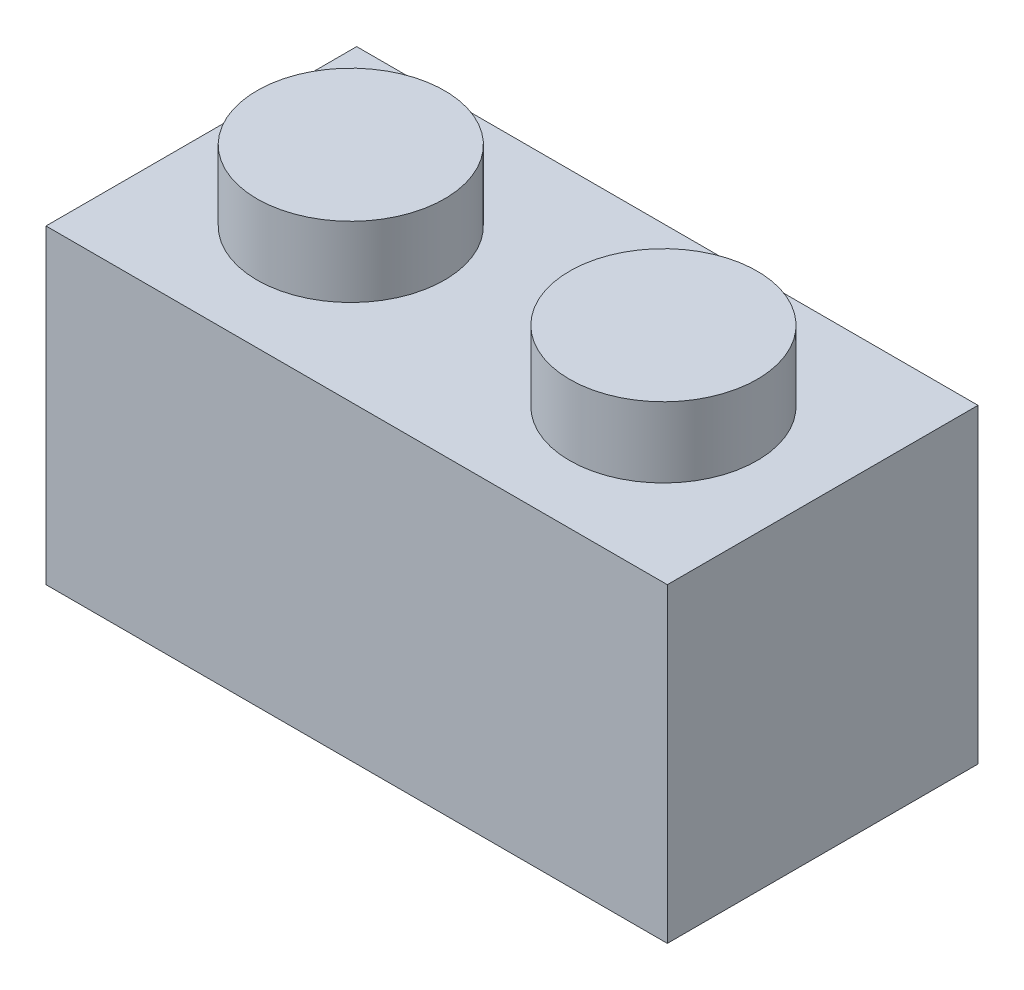
ISO-10303-21;
HEADER;
FILE_DESCRIPTION(('STEP AP214'),'2;1');
FILE_NAME('part.step','',(''),(''),'','','');
FILE_SCHEMA(('AUTOMOTIVE_DESIGN { 1 0 10303 214 1 1 1 1 }'));
ENDSEC;
DATA;
#1=APPLICATION_CONTEXT('core data for automotive mechanical design processes');
#2=APPLICATION_PROTOCOL_DEFINITION('international standard','automotive_design',2000,#1);
#3=PRODUCT_CONTEXT('',#1,'mechanical');
#4=PRODUCT('Part','Part','',(#3));
#5=PRODUCT_RELATED_PRODUCT_CATEGORY('part','',(#4));
#6=PRODUCT_DEFINITION_FORMATION('','',#4);
#7=PRODUCT_DEFINITION_CONTEXT('part definition',#1,'design');
#8=PRODUCT_DEFINITION('design','',#6,#7);
#9=PRODUCT_DEFINITION_SHAPE('','',#8);
#10=(LENGTH_UNIT() NAMED_UNIT(*) SI_UNIT(.MILLI.,.METRE.));
#11=(NAMED_UNIT(*) PLANE_ANGLE_UNIT() SI_UNIT($,.RADIAN.));
#12=(NAMED_UNIT(*) SI_UNIT($,.STERADIAN.) SOLID_ANGLE_UNIT());
#13=UNCERTAINTY_MEASURE_WITH_UNIT(LENGTH_MEASURE(1.E-05),#10,'distance_accuracy_value','');
#14=(GEOMETRIC_REPRESENTATION_CONTEXT(3) GLOBAL_UNCERTAINTY_ASSIGNED_CONTEXT((#13)) GLOBAL_UNIT_ASSIGNED_CONTEXT((#10,
#11,#12)) REPRESENTATION_CONTEXT('',''));
#15=CARTESIAN_POINT('',(0.,0.,0.));
#16=DIRECTION('',(0.,0.,1.));
#17=DIRECTION('',(1.,0.,0.));
#18=AXIS2_PLACEMENT_3D('',#15,#16,#17);
#19=CARTESIAN_POINT('',(-7.95000000000001,-3.975,-7.95));
#20=DIRECTION('',(0.,-1.,0.));
#21=DIRECTION('',(0.,0.,-1.));
#22=AXIS2_PLACEMENT_3D('',#19,#20,#21);
#23=PLANE('',#22);
#24=DIRECTION('',(1.,0.,0.));
#25=VECTOR('',#24,1.);
#26=CARTESIAN_POINT('',(-7.95000000000001,-3.975,0.));
#27=LINE('',#26,#25);
#28=CARTESIAN_POINT('',(-7.95000000000001,-3.975,0.));
#29=VERTEX_POINT('',#28);
#30=CARTESIAN_POINT('',(7.94999999999999,-3.975,0.));
#31=VERTEX_POINT('',#30);
#32=EDGE_CURVE('E175',#29,#31,#27,.T.);
#33=ORIENTED_EDGE('',*,*,#32,.F.);
#34=DIRECTION('',(0.,0.,1.));
#35=VECTOR('',#34,1.);
#36=CARTESIAN_POINT('',(-7.95000000000001,-3.975,-7.95));
#37=LINE('',#36,#35);
#38=CARTESIAN_POINT('',(-7.95000000000001,-3.975,-7.95));
#39=VERTEX_POINT('',#38);
#40=EDGE_CURVE('E43',#39,#29,#37,.T.);
#41=ORIENTED_EDGE('',*,*,#40,.F.);
#42=DIRECTION('',(1.,0.,0.));
#43=VECTOR('',#42,1.);
#44=CARTESIAN_POINT('',(-7.95000000000001,-3.975,-7.95));
#45=LINE('',#44,#43);
#46=CARTESIAN_POINT('',(7.94999999999999,-3.975,-7.95));
#47=VERTEX_POINT('',#46);
#48=EDGE_CURVE('E180',#39,#47,#45,.T.);
#49=ORIENTED_EDGE('',*,*,#48,.T.);
#50=DIRECTION('',(0.,0.,1.));
#51=VECTOR('',#50,1.);
#52=CARTESIAN_POINT('',(7.94999999999999,-3.975,-7.95));
#53=LINE('',#52,#51);
#54=EDGE_CURVE('E11',#47,#31,#53,.T.);
#55=ORIENTED_EDGE('',*,*,#54,.T.);
#56=EDGE_LOOP('',(#33,#41,#49,#55));
#57=FACE_BOUND('',#56,.T.);
#58=DIRECTION('',(0.,0.,1.));
#59=VECTOR('',#58,1.);
#60=CARTESIAN_POINT('',(-6.75000000000001,-3.975,-7.95));
#61=LINE('',#60,#59);
#62=CARTESIAN_POINT('',(-6.75000000000001,-3.975,-6.75));
#63=VERTEX_POINT('',#62);
#64=CARTESIAN_POINT('',(-6.75000000000001,-3.975,-1.2));
#65=VERTEX_POINT('',#64);
#66=EDGE_CURVE('E149',#63,#65,#61,.T.);
#67=ORIENTED_EDGE('',*,*,#66,.T.);
#68=DIRECTION('',(1.,0.,0.));
#69=VECTOR('',#68,1.);
#70=CARTESIAN_POINT('',(-7.95000000000001,-3.975,-1.2));
#71=LINE('',#70,#69);
#72=CARTESIAN_POINT('',(6.75,-3.975,-1.2));
#73=VERTEX_POINT('',#72);
#74=EDGE_CURVE('E138',#65,#73,#71,.T.);
#75=ORIENTED_EDGE('',*,*,#74,.T.);
#76=DIRECTION('',(0.,0.,1.));
#77=VECTOR('',#76,1.);
#78=CARTESIAN_POINT('',(6.75,-3.975,-7.95));
#79=LINE('',#78,#77);
#80=CARTESIAN_POINT('',(6.75,-3.975,-6.75));
#81=VERTEX_POINT('',#80);
#82=EDGE_CURVE('E130',#81,#73,#79,.T.);
#83=ORIENTED_EDGE('',*,*,#82,.F.);
#84=DIRECTION('',(1.,0.,0.));
#85=VECTOR('',#84,1.);
#86=CARTESIAN_POINT('',(-7.95000000000001,-3.975,-6.75));
#87=LINE('',#86,#85);
#88=EDGE_CURVE('E51',#63,#81,#87,.T.);
#89=ORIENTED_EDGE('',*,*,#88,.F.);
#90=EDGE_LOOP('',(#67,#75,#83,#89));
#91=FACE_BOUND('',#90,.T.);
#92=ADVANCED_FACE('F34',(#57,#91),#23,.T.);
#93=CARTESIAN_POINT('',(7.94999999999999,-3.975,-7.95));
#94=DIRECTION('',(1.,0.,0.));
#95=DIRECTION('',(0.,0.,-1.));
#96=AXIS2_PLACEMENT_3D('',#93,#94,#95);
#97=PLANE('',#96);
#98=DIRECTION('',(0.,1.,0.));
#99=VECTOR('',#98,1.);
#100=CARTESIAN_POINT('',(7.94999999999999,-3.975,0.));
#101=LINE('',#100,#99);
#102=CARTESIAN_POINT('',(7.94999999999999,3.975,0.));
#103=VERTEX_POINT('',#102);
#104=EDGE_CURVE('E169',#31,#103,#101,.T.);
#105=ORIENTED_EDGE('',*,*,#104,.F.);
#106=ORIENTED_EDGE('',*,*,#54,.F.);
#107=DIRECTION('',(0.,1.,0.));
#108=VECTOR('',#107,1.);
#109=CARTESIAN_POINT('',(7.94999999999999,-3.975,-7.95));
#110=LINE('',#109,#108);
#111=CARTESIAN_POINT('',(7.94999999999999,3.975,-7.95));
#112=VERTEX_POINT('',#111);
#113=EDGE_CURVE('E172',#47,#112,#110,.T.);
#114=ORIENTED_EDGE('',*,*,#113,.T.);
#115=DIRECTION('',(0.,0.,1.));
#116=VECTOR('',#115,1.);
#117=CARTESIAN_POINT('',(7.94999999999999,3.975,-7.95));
#118=LINE('',#117,#116);
#119=EDGE_CURVE('E38',#112,#103,#118,.T.);
#120=ORIENTED_EDGE('',*,*,#119,.T.);
#121=EDGE_LOOP('',(#105,#106,#114,#120));
#122=FACE_BOUND('',#121,.T.);
#123=ADVANCED_FACE('F36',(#122),#97,.T.);
#124=CARTESIAN_POINT('',(-7.95000000000001,-3.975,-7.95));
#125=DIRECTION('',(-1.,0.,0.));
#126=DIRECTION('',(0.,0.,1.));
#127=AXIS2_PLACEMENT_3D('',#124,#125,#126);
#128=PLANE('',#127);
#129=DIRECTION('',(0.,-1.,0.));
#130=VECTOR('',#129,1.);
#131=CARTESIAN_POINT('',(-7.95000000000001,-3.975,0.));
#132=LINE('',#131,#130);
#133=CARTESIAN_POINT('',(-7.95000000000001,3.975,0.));
#134=VERTEX_POINT('',#133);
#135=EDGE_CURVE('E187',#134,#29,#132,.T.);
#136=ORIENTED_EDGE('',*,*,#135,.F.);
#137=DIRECTION('',(0.,0.,1.));
#138=VECTOR('',#137,1.);
#139=CARTESIAN_POINT('',(-7.95000000000001,3.975,-7.95));
#140=LINE('',#139,#138);
#141=CARTESIAN_POINT('',(-7.95000000000001,3.975,-7.95));
#142=VERTEX_POINT('',#141);
#143=EDGE_CURVE('E192',#142,#134,#140,.T.);
#144=ORIENTED_EDGE('',*,*,#143,.F.);
#145=DIRECTION('',(0.,-1.,0.));
#146=VECTOR('',#145,1.);
#147=CARTESIAN_POINT('',(-7.95000000000001,-3.975,-7.95));
#148=LINE('',#147,#146);
#149=EDGE_CURVE('E177',#142,#39,#148,.T.);
#150=ORIENTED_EDGE('',*,*,#149,.T.);
#151=ORIENTED_EDGE('',*,*,#40,.T.);
#152=EDGE_LOOP('',(#136,#144,#150,#151));
#153=FACE_BOUND('',#152,.T.);
#154=ADVANCED_FACE('F201',(#153),#128,.T.);
#155=CARTESIAN_POINT('',(-7.95000000000001,3.975,-7.95));
#156=DIRECTION('',(0.,1.,0.));
#157=DIRECTION('',(0.,0.,1.));
#158=AXIS2_PLACEMENT_3D('',#155,#156,#157);
#159=PLANE('',#158);
#160=CARTESIAN_POINT('',(3.95,3.975,-3.9));
#161=DIRECTION('',(0.,1.,0.));
#162=DIRECTION('',(0.,0.,1.));
#163=AXIS2_PLACEMENT_3D('',#160,#161,#162);
#164=CIRCLE('',#163,2.4);
#165=CARTESIAN_POINT('',(3.95,3.975,-1.5));
#166=VERTEX_POINT('',#165);
#167=EDGE_CURVE('E155',#166,#166,#164,.T.);
#168=ORIENTED_EDGE('',*,*,#167,.F.);
#169=EDGE_LOOP('',(#168));
#170=FACE_BOUND('',#169,.T.);
#171=CARTESIAN_POINT('',(-4.05,3.975,-3.9));
#172=DIRECTION('',(0.,1.,0.));
#173=DIRECTION('',(0.,0.,1.));
#174=AXIS2_PLACEMENT_3D('',#171,#172,#173);
#175=CIRCLE('',#174,2.4);
#176=CARTESIAN_POINT('',(-4.05,3.975,-1.5));
#177=VERTEX_POINT('',#176);
#178=EDGE_CURVE('E165',#177,#177,#175,.T.);
#179=ORIENTED_EDGE('',*,*,#178,.F.);
#180=EDGE_LOOP('',(#179));
#181=FACE_BOUND('',#180,.T.);
#182=DIRECTION('',(-1.,0.,0.));
#183=VECTOR('',#182,1.);
#184=CARTESIAN_POINT('',(-7.95000000000001,3.975,0.));
#185=LINE('',#184,#183);
#186=EDGE_CURVE('E184',#103,#134,#185,.T.);
#187=ORIENTED_EDGE('',*,*,#186,.F.);
#188=ORIENTED_EDGE('',*,*,#119,.F.);
#189=DIRECTION('',(-1.,0.,0.));
#190=VECTOR('',#189,1.);
#191=CARTESIAN_POINT('',(-7.95000000000001,3.975,-7.95));
#192=LINE('',#191,#190);
#193=EDGE_CURVE('E174',#112,#142,#192,.T.);
#194=ORIENTED_EDGE('',*,*,#193,.T.);
#195=ORIENTED_EDGE('',*,*,#143,.T.);
#196=EDGE_LOOP('',(#187,#188,#194,#195));
#197=FACE_BOUND('',#196,.T.);
#198=ADVANCED_FACE('F194',(#170,#181,#197),#159,.T.);
#199=CARTESIAN_POINT('',(0.,0.,-7.95));
#200=DIRECTION('',(0.,0.,-1.));
#201=DIRECTION('',(-1.,0.,0.));
#202=AXIS2_PLACEMENT_3D('',#199,#200,#201);
#203=PLANE('',#202);
#204=ORIENTED_EDGE('',*,*,#113,.F.);
#205=ORIENTED_EDGE('',*,*,#48,.F.);
#206=ORIENTED_EDGE('',*,*,#149,.F.);
#207=ORIENTED_EDGE('',*,*,#193,.F.);
#208=EDGE_LOOP('',(#204,#205,#206,#207));
#209=FACE_BOUND('',#208,.T.);
#210=ADVANCED_FACE('F203',(#209),#203,.T.);
#211=CARTESIAN_POINT('',(0.,0.,0.));
#212=DIRECTION('',(0.,0.,-1.));
#213=DIRECTION('',(-1.,0.,0.));
#214=AXIS2_PLACEMENT_3D('',#211,#212,#213);
#215=PLANE('',#214);
#216=ORIENTED_EDGE('',*,*,#104,.T.);
#217=ORIENTED_EDGE('',*,*,#186,.T.);
#218=ORIENTED_EDGE('',*,*,#135,.T.);
#219=ORIENTED_EDGE('',*,*,#32,.T.);
#220=EDGE_LOOP('',(#216,#217,#218,#219));
#221=FACE_BOUND('',#220,.T.);
#222=ADVANCED_FACE('F196',(#221),#215,.F.);
#223=CARTESIAN_POINT('',(-4.05,5.775,-3.9));
#224=DIRECTION('',(0.,-1.,0.));
#225=DIRECTION('',(0.,0.,-1.));
#226=AXIS2_PLACEMENT_3D('',#223,#224,#225);
#227=CYLINDRICAL_SURFACE('',#226,2.4);
#228=CARTESIAN_POINT('',(-4.05,5.775,-3.9));
#229=DIRECTION('',(0.,1.,0.));
#230=DIRECTION('',(0.,0.,1.));
#231=AXIS2_PLACEMENT_3D('',#228,#229,#230);
#232=CIRCLE('',#231,2.4);
#233=CARTESIAN_POINT('',(-4.05,5.775,-1.5));
#234=VERTEX_POINT('',#233);
#235=EDGE_CURVE('E166',#234,#234,#232,.T.);
#236=ORIENTED_EDGE('',*,*,#235,.F.);
#237=EDGE_LOOP('',(#236));
#238=FACE_BOUND('',#237,.T.);
#239=ORIENTED_EDGE('',*,*,#178,.T.);
#240=EDGE_LOOP('',(#239));
#241=FACE_BOUND('',#240,.T.);
#242=ADVANCED_FACE('F210',(#238,#241),#227,.T.);
#243=CARTESIAN_POINT('',(-4.05,5.775,-3.9));
#244=DIRECTION('',(0.,1.,0.));
#245=DIRECTION('',(0.,0.,1.));
#246=AXIS2_PLACEMENT_3D('',#243,#244,#245);
#247=PLANE('',#246);
#248=ORIENTED_EDGE('',*,*,#235,.T.);
#249=EDGE_LOOP('',(#248));
#250=FACE_BOUND('',#249,.T.);
#251=ADVANCED_FACE('F236',(#250),#247,.T.);
#252=CARTESIAN_POINT('',(3.95,5.775,-3.9));
#253=DIRECTION('',(0.,-1.,0.));
#254=DIRECTION('',(0.,0.,-1.));
#255=AXIS2_PLACEMENT_3D('',#252,#253,#254);
#256=CYLINDRICAL_SURFACE('',#255,2.4);
#257=CARTESIAN_POINT('',(3.95,5.775,-3.9));
#258=DIRECTION('',(0.,1.,0.));
#259=DIRECTION('',(0.,0.,1.));
#260=AXIS2_PLACEMENT_3D('',#257,#258,#259);
#261=CIRCLE('',#260,2.4);
#262=CARTESIAN_POINT('',(3.95,5.775,-1.5));
#263=VERTEX_POINT('',#262);
#264=EDGE_CURVE('E162',#263,#263,#261,.T.);
#265=ORIENTED_EDGE('',*,*,#264,.F.);
#266=EDGE_LOOP('',(#265));
#267=FACE_BOUND('',#266,.T.);
#268=ORIENTED_EDGE('',*,*,#167,.T.);
#269=EDGE_LOOP('',(#268));
#270=FACE_BOUND('',#269,.T.);
#271=ADVANCED_FACE('F241',(#267,#270),#256,.T.);
#272=CARTESIAN_POINT('',(3.95,5.775,-3.9));
#273=DIRECTION('',(0.,1.,0.));
#274=DIRECTION('',(0.,0.,1.));
#275=AXIS2_PLACEMENT_3D('',#272,#273,#274);
#276=PLANE('',#275);
#277=ORIENTED_EDGE('',*,*,#264,.T.);
#278=EDGE_LOOP('',(#277));
#279=FACE_BOUND('',#278,.T.);
#280=ADVANCED_FACE('F246',(#279),#276,.T.);
#281=CARTESIAN_POINT('',(6.75,-3.975,-7.95));
#282=DIRECTION('',(1.,0.,0.));
#283=DIRECTION('',(0.,0.,-1.));
#284=AXIS2_PLACEMENT_3D('',#281,#282,#283);
#285=PLANE('',#284);
#286=DIRECTION('',(0.,1.,0.));
#287=VECTOR('',#286,1.);
#288=CARTESIAN_POINT('',(6.75,-3.975,-1.2));
#289=LINE('',#288,#287);
#290=CARTESIAN_POINT('',(6.75,2.775,-1.2));
#291=VERTEX_POINT('',#290);
#292=EDGE_CURVE('E124',#73,#291,#289,.T.);
#293=ORIENTED_EDGE('',*,*,#292,.T.);
#294=DIRECTION('',(0.,0.,1.));
#295=VECTOR('',#294,1.);
#296=CARTESIAN_POINT('',(6.75,2.775,-7.95));
#297=LINE('',#296,#295);
#298=CARTESIAN_POINT('',(6.75,2.775,-6.75));
#299=VERTEX_POINT('',#298);
#300=EDGE_CURVE('E109',#299,#291,#297,.T.);
#301=ORIENTED_EDGE('',*,*,#300,.F.);
#302=DIRECTION('',(0.,1.,0.));
#303=VECTOR('',#302,1.);
#304=CARTESIAN_POINT('',(6.75,-3.975,-6.75));
#305=LINE('',#304,#303);
#306=EDGE_CURVE('E137',#81,#299,#305,.T.);
#307=ORIENTED_EDGE('',*,*,#306,.F.);
#308=ORIENTED_EDGE('',*,*,#82,.T.);
#309=EDGE_LOOP('',(#293,#301,#307,#308));
#310=FACE_BOUND('',#309,.T.);
#311=ADVANCED_FACE('F128',(#310),#285,.F.);
#312=CARTESIAN_POINT('',(-6.75000000000001,-3.975,-7.95));
#313=DIRECTION('',(-1.,0.,0.));
#314=DIRECTION('',(0.,0.,1.));
#315=AXIS2_PLACEMENT_3D('',#312,#313,#314);
#316=PLANE('',#315);
#317=DIRECTION('',(0.,-1.,0.));
#318=VECTOR('',#317,1.);
#319=CARTESIAN_POINT('',(-6.75000000000001,-3.975,-1.2));
#320=LINE('',#319,#318);
#321=CARTESIAN_POINT('',(-6.75000000000001,2.775,-1.2));
#322=VERTEX_POINT('',#321);
#323=EDGE_CURVE('E126',#322,#65,#320,.T.);
#324=ORIENTED_EDGE('',*,*,#323,.T.);
#325=ORIENTED_EDGE('',*,*,#66,.F.);
#326=DIRECTION('',(0.,-1.,0.));
#327=VECTOR('',#326,1.);
#328=CARTESIAN_POINT('',(-6.75000000000001,-3.975,-6.75));
#329=LINE('',#328,#327);
#330=CARTESIAN_POINT('',(-6.75000000000001,2.775,-6.75));
#331=VERTEX_POINT('',#330);
#332=EDGE_CURVE('E147',#331,#63,#329,.T.);
#333=ORIENTED_EDGE('',*,*,#332,.F.);
#334=DIRECTION('',(0.,0.,1.));
#335=VECTOR('',#334,1.);
#336=CARTESIAN_POINT('',(-6.75000000000001,2.775,-7.95));
#337=LINE('',#336,#335);
#338=EDGE_CURVE('E117',#331,#322,#337,.T.);
#339=ORIENTED_EDGE('',*,*,#338,.T.);
#340=EDGE_LOOP('',(#324,#325,#333,#339));
#341=FACE_BOUND('',#340,.T.);
#342=ADVANCED_FACE('F269',(#341),#316,.F.);
#343=CARTESIAN_POINT('',(-7.95000000000001,2.775,-7.95));
#344=DIRECTION('',(0.,1.,0.));
#345=DIRECTION('',(0.,0.,1.));
#346=AXIS2_PLACEMENT_3D('',#343,#344,#345);
#347=PLANE('',#346);
#348=CARTESIAN_POINT('',(3.95,2.775,-3.9));
#349=DIRECTION('',(0.,1.,0.));
#350=DIRECTION('',(0.,0.,1.));
#351=AXIS2_PLACEMENT_3D('',#348,#349,#350);
#352=CIRCLE('',#351,1.2);
#353=CARTESIAN_POINT('',(3.95,2.775,-2.7));
#354=VERTEX_POINT('',#353);
#355=EDGE_CURVE('E140',#354,#354,#352,.T.);
#356=ORIENTED_EDGE('',*,*,#355,.T.);
#357=EDGE_LOOP('',(#356));
#358=FACE_BOUND('',#357,.T.);
#359=CARTESIAN_POINT('',(-4.05,2.775,-3.9));
#360=DIRECTION('',(0.,1.,0.));
#361=DIRECTION('',(0.,0.,1.));
#362=AXIS2_PLACEMENT_3D('',#359,#360,#361);
#363=CIRCLE('',#362,1.2);
#364=CARTESIAN_POINT('',(-4.05,2.775,-2.7));
#365=VERTEX_POINT('',#364);
#366=EDGE_CURVE('E134',#365,#365,#363,.T.);
#367=ORIENTED_EDGE('',*,*,#366,.T.);
#368=EDGE_LOOP('',(#367));
#369=FACE_BOUND('',#368,.T.);
#370=DIRECTION('',(-1.,0.,0.));
#371=VECTOR('',#370,1.);
#372=CARTESIAN_POINT('',(-7.95000000000001,2.775,-1.2));
#373=LINE('',#372,#371);
#374=EDGE_CURVE('E112',#291,#322,#373,.T.);
#375=ORIENTED_EDGE('',*,*,#374,.T.);
#376=ORIENTED_EDGE('',*,*,#338,.F.);
#377=DIRECTION('',(-1.,0.,0.));
#378=VECTOR('',#377,1.);
#379=CARTESIAN_POINT('',(-7.95000000000001,2.775,-6.75));
#380=LINE('',#379,#378);
#381=EDGE_CURVE('E114',#299,#331,#380,.T.);
#382=ORIENTED_EDGE('',*,*,#381,.F.);
#383=ORIENTED_EDGE('',*,*,#300,.T.);
#384=EDGE_LOOP('',(#375,#376,#382,#383));
#385=FACE_BOUND('',#384,.T.);
#386=ADVANCED_FACE('F111',(#358,#369,#385),#347,.F.);
#387=CARTESIAN_POINT('',(0.,0.,-6.75));
#388=DIRECTION('',(0.,0.,-1.));
#389=DIRECTION('',(-1.,0.,0.));
#390=AXIS2_PLACEMENT_3D('',#387,#388,#389);
#391=PLANE('',#390);
#392=ORIENTED_EDGE('',*,*,#306,.T.);
#393=ORIENTED_EDGE('',*,*,#381,.T.);
#394=ORIENTED_EDGE('',*,*,#332,.T.);
#395=ORIENTED_EDGE('',*,*,#88,.T.);
#396=EDGE_LOOP('',(#392,#393,#394,#395));
#397=FACE_BOUND('',#396,.T.);
#398=ADVANCED_FACE('F287',(#397),#391,.F.);
#399=CARTESIAN_POINT('',(0.,0.,-1.2));
#400=DIRECTION('',(0.,0.,-1.));
#401=DIRECTION('',(-1.,0.,0.));
#402=AXIS2_PLACEMENT_3D('',#399,#400,#401);
#403=PLANE('',#402);
#404=ORIENTED_EDGE('',*,*,#292,.F.);
#405=ORIENTED_EDGE('',*,*,#74,.F.);
#406=ORIENTED_EDGE('',*,*,#323,.F.);
#407=ORIENTED_EDGE('',*,*,#374,.F.);
#408=EDGE_LOOP('',(#404,#405,#406,#407));
#409=FACE_BOUND('',#408,.T.);
#410=ADVANCED_FACE('F122',(#409),#403,.T.);
#411=CARTESIAN_POINT('',(-4.05,5.775,-3.9));
#412=DIRECTION('',(0.,-1.,0.));
#413=DIRECTION('',(0.,0.,-1.));
#414=AXIS2_PLACEMENT_3D('',#411,#412,#413);
#415=CYLINDRICAL_SURFACE('',#414,1.2);
#416=CARTESIAN_POINT('',(-4.05,4.575,-3.9));
#417=DIRECTION('',(0.,1.,0.));
#418=DIRECTION('',(0.,0.,1.));
#419=AXIS2_PLACEMENT_3D('',#416,#417,#418);
#420=CIRCLE('',#419,1.2);
#421=CARTESIAN_POINT('',(-4.05,4.575,-2.7));
#422=VERTEX_POINT('',#421);
#423=EDGE_CURVE('E131',#422,#422,#420,.T.);
#424=ORIENTED_EDGE('',*,*,#423,.T.);
#425=EDGE_LOOP('',(#424));
#426=FACE_BOUND('',#425,.T.);
#427=ORIENTED_EDGE('',*,*,#366,.F.);
#428=EDGE_LOOP('',(#427));
#429=FACE_BOUND('',#428,.T.);
#430=ADVANCED_FACE('F305',(#426,#429),#415,.F.);
#431=CARTESIAN_POINT('',(-4.05,4.575,-3.9));
#432=DIRECTION('',(0.,1.,0.));
#433=DIRECTION('',(0.,0.,1.));
#434=AXIS2_PLACEMENT_3D('',#431,#432,#433);
#435=PLANE('',#434);
#436=ORIENTED_EDGE('',*,*,#423,.F.);
#437=EDGE_LOOP('',(#436));
#438=FACE_BOUND('',#437,.T.);
#439=ADVANCED_FACE('F314',(#438),#435,.F.);
#440=CARTESIAN_POINT('',(3.95,5.775,-3.9));
#441=DIRECTION('',(0.,-1.,0.));
#442=DIRECTION('',(0.,0.,-1.));
#443=AXIS2_PLACEMENT_3D('',#440,#441,#442);
#444=CYLINDRICAL_SURFACE('',#443,1.2);
#445=CARTESIAN_POINT('',(3.95,4.575,-3.9));
#446=DIRECTION('',(0.,1.,0.));
#447=DIRECTION('',(0.,0.,1.));
#448=AXIS2_PLACEMENT_3D('',#445,#446,#447);
#449=CIRCLE('',#448,1.2);
#450=CARTESIAN_POINT('',(3.95,4.575,-2.7));
#451=VERTEX_POINT('',#450);
#452=EDGE_CURVE('E143',#451,#451,#449,.T.);
#453=ORIENTED_EDGE('',*,*,#452,.T.);
#454=EDGE_LOOP('',(#453));
#455=FACE_BOUND('',#454,.T.);
#456=ORIENTED_EDGE('',*,*,#355,.F.);
#457=EDGE_LOOP('',(#456));
#458=FACE_BOUND('',#457,.T.);
#459=ADVANCED_FACE('F324',(#455,#458),#444,.F.);
#460=CARTESIAN_POINT('',(3.95,4.575,-3.9));
#461=DIRECTION('',(0.,1.,0.));
#462=DIRECTION('',(0.,0.,1.));
#463=AXIS2_PLACEMENT_3D('',#460,#461,#462);
#464=PLANE('',#463);
#465=ORIENTED_EDGE('',*,*,#452,.F.);
#466=EDGE_LOOP('',(#465));
#467=FACE_BOUND('',#466,.T.);
#468=ADVANCED_FACE('F334',(#467),#464,.F.);
#469=CLOSED_SHELL('',(#92,#123,#154,#198,#210,#222,#242,#251,#271,#280,#311,#342,#386,#398,#410,
#430,#439,#459,#468));
#470=MANIFOLD_SOLID_BREP('B2',#469);
#471=ADVANCED_BREP_SHAPE_REPRESENTATION('',(#18,#470),#14);
#472=SHAPE_DEFINITION_REPRESENTATION(#9,#471);
ENDSEC;
END-ISO-10303-21;
